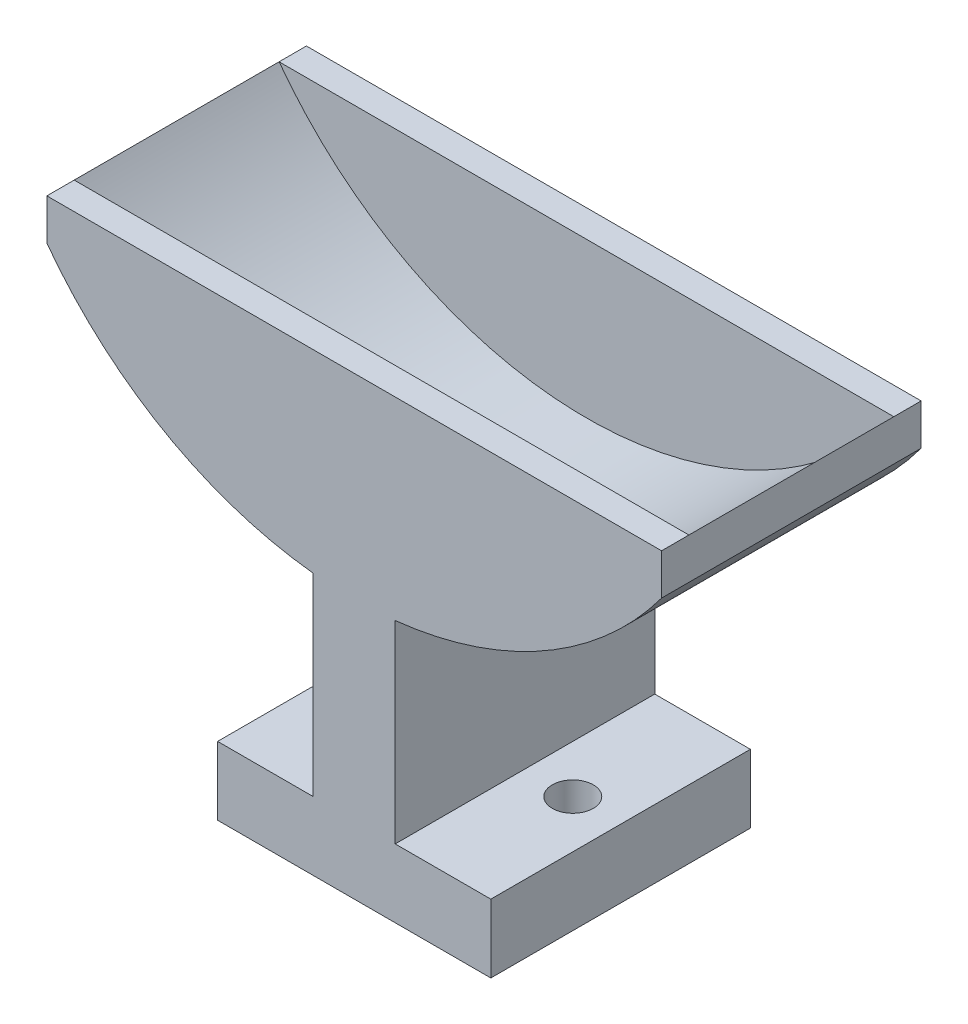
ISO-10303-21;
HEADER;
FILE_DESCRIPTION(('STEP AP214'),'2;1');
FILE_NAME('part.step','',(''),(''),'','','');
FILE_SCHEMA(('AUTOMOTIVE_DESIGN { 1 0 10303 214 1 1 1 1 }'));
ENDSEC;
DATA;
#1=APPLICATION_CONTEXT('core data for automotive mechanical design processes');
#2=APPLICATION_PROTOCOL_DEFINITION('international standard','automotive_design',2000,#1);
#3=PRODUCT_CONTEXT('',#1,'mechanical');
#4=PRODUCT('Part','Part','',(#3));
#5=PRODUCT_RELATED_PRODUCT_CATEGORY('part','',(#4));
#6=PRODUCT_DEFINITION_FORMATION('','',#4);
#7=PRODUCT_DEFINITION_CONTEXT('part definition',#1,'design');
#8=PRODUCT_DEFINITION('design','',#6,#7);
#9=PRODUCT_DEFINITION_SHAPE('','',#8);
#10=(LENGTH_UNIT() NAMED_UNIT(*) SI_UNIT(.MILLI.,.METRE.));
#11=(NAMED_UNIT(*) PLANE_ANGLE_UNIT() SI_UNIT($,.RADIAN.));
#12=(NAMED_UNIT(*) SI_UNIT($,.STERADIAN.) SOLID_ANGLE_UNIT());
#13=UNCERTAINTY_MEASURE_WITH_UNIT(LENGTH_MEASURE(1.E-05),#10,'distance_accuracy_value','');
#14=(GEOMETRIC_REPRESENTATION_CONTEXT(3) GLOBAL_UNCERTAINTY_ASSIGNED_CONTEXT((#13)) GLOBAL_UNIT_ASSIGNED_CONTEXT((#10,
#11,#12)) REPRESENTATION_CONTEXT('',''));
#15=CARTESIAN_POINT('',(0.,0.,0.));
#16=DIRECTION('',(0.,0.,1.));
#17=DIRECTION('',(1.,0.,0.));
#18=AXIS2_PLACEMENT_3D('',#15,#16,#17);
#19=CARTESIAN_POINT('',(13.,0.,19.));
#20=DIRECTION('',(-1.,0.,0.));
#21=DIRECTION('',(0.,0.,1.));
#22=AXIS2_PLACEMENT_3D('',#19,#20,#21);
#23=PLANE('',#22);
#24=DIRECTION('',(0.,1.,0.));
#25=VECTOR('',#24,1.);
#26=CARTESIAN_POINT('',(13.,0.,0.));
#27=LINE('',#26,#25);
#28=CARTESIAN_POINT('',(13.,5.,0.));
#29=VERTEX_POINT('',#28);
#30=CARTESIAN_POINT('',(13.,19.1611781858499,0.));
#31=VERTEX_POINT('',#30);
#32=EDGE_CURVE('E166',#29,#31,#27,.T.);
#33=ORIENTED_EDGE('',*,*,#32,.T.);
#34=DIRECTION('',(0.,0.,-1.));
#35=VECTOR('',#34,1.);
#36=CARTESIAN_POINT('',(13.,19.1611781858499,19.));
#37=LINE('',#36,#35);
#38=CARTESIAN_POINT('',(13.,19.1611781858499,19.));
#39=VERTEX_POINT('',#38);
#40=EDGE_CURVE('E12',#39,#31,#37,.T.);
#41=ORIENTED_EDGE('',*,*,#40,.F.);
#42=DIRECTION('',(0.,1.,0.));
#43=VECTOR('',#42,1.);
#44=CARTESIAN_POINT('',(13.,0.,19.));
#45=LINE('',#44,#43);
#46=CARTESIAN_POINT('',(13.,5.,19.));
#47=VERTEX_POINT('',#46);
#48=EDGE_CURVE('E229',#47,#39,#45,.T.);
#49=ORIENTED_EDGE('',*,*,#48,.F.);
#50=DIRECTION('',(0.,0.,-1.));
#51=VECTOR('',#50,1.);
#52=CARTESIAN_POINT('',(13.,5.,19.));
#53=LINE('',#52,#51);
#54=EDGE_CURVE('E224',#47,#29,#53,.T.);
#55=ORIENTED_EDGE('',*,*,#54,.T.);
#56=EDGE_LOOP('',(#33,#41,#49,#55));
#57=FACE_BOUND('',#56,.T.);
#58=ADVANCED_FACE('F70',(#57),#23,.F.);
#59=CARTESIAN_POINT('',(7.,0.,19.));
#60=DIRECTION('',(-1.,0.,0.));
#61=DIRECTION('',(0.,0.,1.));
#62=AXIS2_PLACEMENT_3D('',#59,#60,#61);
#63=PLANE('',#62);
#64=DIRECTION('',(0.,1.,0.));
#65=VECTOR('',#64,1.);
#66=CARTESIAN_POINT('',(7.,0.,0.));
#67=LINE('',#66,#65);
#68=CARTESIAN_POINT('',(7.,5.,0.));
#69=VERTEX_POINT('',#68);
#70=CARTESIAN_POINT('',(7.,19.1611781858499,0.));
#71=VERTEX_POINT('',#70);
#72=EDGE_CURVE('E152',#69,#71,#67,.T.);
#73=ORIENTED_EDGE('',*,*,#72,.F.);
#74=DIRECTION('',(0.,0.,-1.));
#75=VECTOR('',#74,1.);
#76=CARTESIAN_POINT('',(7.,5.,19.));
#77=LINE('',#76,#75);
#78=CARTESIAN_POINT('',(7.,5.,19.));
#79=VERTEX_POINT('',#78);
#80=EDGE_CURVE('E212',#79,#69,#77,.T.);
#81=ORIENTED_EDGE('',*,*,#80,.F.);
#82=DIRECTION('',(0.,1.,0.));
#83=VECTOR('',#82,1.);
#84=CARTESIAN_POINT('',(7.,0.,19.));
#85=LINE('',#84,#83);
#86=CARTESIAN_POINT('',(7.,19.1611781858499,19.));
#87=VERTEX_POINT('',#86);
#88=EDGE_CURVE('E254',#79,#87,#85,.T.);
#89=ORIENTED_EDGE('',*,*,#88,.T.);
#90=DIRECTION('',(0.,0.,-1.));
#91=VECTOR('',#90,1.);
#92=CARTESIAN_POINT('',(7.,19.1611781858499,19.));
#93=LINE('',#92,#91);
#94=EDGE_CURVE('E79',#87,#71,#93,.T.);
#95=ORIENTED_EDGE('',*,*,#94,.T.);
#96=EDGE_LOOP('',(#73,#81,#89,#95));
#97=FACE_BOUND('',#96,.T.);
#98=ADVANCED_FACE('F333',(#97),#63,.T.);
#99=CARTESIAN_POINT('',(0.,5.,19.));
#100=DIRECTION('',(0.,1.,0.));
#101=DIRECTION('',(-1.,0.,0.));
#102=AXIS2_PLACEMENT_3D('',#99,#100,#101);
#103=PLANE('',#102);
#104=CARTESIAN_POINT('',(3.5,5.,9.5));
#105=DIRECTION('',(0.,1.,0.));
#106=DIRECTION('',(1.,0.,0.));
#107=AXIS2_PLACEMENT_3D('',#104,#105,#106);
#108=CIRCLE('',#107,1.5);
#109=CARTESIAN_POINT('',(5.,5.,9.5));
#110=VERTEX_POINT('',#109);
#111=EDGE_CURVE('E277',#110,#110,#108,.T.);
#112=ORIENTED_EDGE('',*,*,#111,.F.);
#113=EDGE_LOOP('',(#112));
#114=FACE_BOUND('',#113,.T.);
#115=DIRECTION('',(1.,0.,0.));
#116=VECTOR('',#115,1.);
#117=CARTESIAN_POINT('',(0.,5.,0.));
#118=LINE('',#117,#116);
#119=CARTESIAN_POINT('',(0.,5.,0.));
#120=VERTEX_POINT('',#119);
#121=EDGE_CURVE('E237',#120,#69,#118,.T.);
#122=ORIENTED_EDGE('',*,*,#121,.F.);
#123=DIRECTION('',(0.,0.,-1.));
#124=VECTOR('',#123,1.);
#125=CARTESIAN_POINT('',(0.,5.,19.));
#126=LINE('',#125,#124);
#127=CARTESIAN_POINT('',(0.,5.,19.));
#128=VERTEX_POINT('',#127);
#129=EDGE_CURVE('E214',#128,#120,#126,.T.);
#130=ORIENTED_EDGE('',*,*,#129,.F.);
#131=DIRECTION('',(1.,0.,0.));
#132=VECTOR('',#131,1.);
#133=CARTESIAN_POINT('',(0.,5.,19.));
#134=LINE('',#133,#132);
#135=EDGE_CURVE('E251',#128,#79,#134,.T.);
#136=ORIENTED_EDGE('',*,*,#135,.T.);
#137=ORIENTED_EDGE('',*,*,#80,.T.);
#138=EDGE_LOOP('',(#122,#130,#136,#137));
#139=FACE_BOUND('',#138,.T.);
#140=ADVANCED_FACE('F330',(#114,#139),#103,.T.);
#141=CARTESIAN_POINT('',(0.,0.,19.));
#142=DIRECTION('',(-1.,0.,0.));
#143=DIRECTION('',(0.,0.,1.));
#144=AXIS2_PLACEMENT_3D('',#141,#142,#143);
#145=PLANE('',#144);
#146=DIRECTION('',(0.,1.,0.));
#147=VECTOR('',#146,1.);
#148=CARTESIAN_POINT('',(0.,0.,0.));
#149=LINE('',#148,#147);
#150=CARTESIAN_POINT('',(0.,0.,0.));
#151=VERTEX_POINT('',#150);
#152=EDGE_CURVE('E234',#151,#120,#149,.T.);
#153=ORIENTED_EDGE('',*,*,#152,.F.);
#154=DIRECTION('',(0.,0.,-1.));
#155=VECTOR('',#154,1.);
#156=CARTESIAN_POINT('',(0.,0.,19.));
#157=LINE('',#156,#155);
#158=CARTESIAN_POINT('',(0.,0.,19.));
#159=VERTEX_POINT('',#158);
#160=EDGE_CURVE('E216',#159,#151,#157,.T.);
#161=ORIENTED_EDGE('',*,*,#160,.F.);
#162=DIRECTION('',(0.,1.,0.));
#163=VECTOR('',#162,1.);
#164=CARTESIAN_POINT('',(0.,0.,19.));
#165=LINE('',#164,#163);
#166=EDGE_CURVE('E248',#159,#128,#165,.T.);
#167=ORIENTED_EDGE('',*,*,#166,.T.);
#168=ORIENTED_EDGE('',*,*,#129,.T.);
#169=EDGE_LOOP('',(#153,#161,#167,#168));
#170=FACE_BOUND('',#169,.T.);
#171=ADVANCED_FACE('F327',(#170),#145,.T.);
#172=CARTESIAN_POINT('',(0.,0.,19.));
#173=DIRECTION('',(0.,1.,0.));
#174=DIRECTION('',(0.,0.,1.));
#175=AXIS2_PLACEMENT_3D('',#172,#173,#174);
#176=PLANE('',#175);
#177=CARTESIAN_POINT('',(16.5,0.,9.5));
#178=DIRECTION('',(0.,1.,0.));
#179=DIRECTION('',(0.,0.,1.));
#180=AXIS2_PLACEMENT_3D('',#177,#178,#179);
#181=CIRCLE('',#180,1.5);
#182=CARTESIAN_POINT('',(16.5,0.,11.));
#183=VERTEX_POINT('',#182);
#184=EDGE_CURVE('E271',#183,#183,#181,.F.);
#185=ORIENTED_EDGE('',*,*,#184,.F.);
#186=EDGE_LOOP('',(#185));
#187=FACE_BOUND('',#186,.T.);
#188=CARTESIAN_POINT('',(3.5,0.,9.5));
#189=DIRECTION('',(0.,1.,0.));
#190=DIRECTION('',(0.,0.,1.));
#191=AXIS2_PLACEMENT_3D('',#188,#189,#190);
#192=CIRCLE('',#191,1.5);
#193=CARTESIAN_POINT('',(3.5,0.,11.));
#194=VERTEX_POINT('',#193);
#195=EDGE_CURVE('E273',#194,#194,#192,.F.);
#196=ORIENTED_EDGE('',*,*,#195,.F.);
#197=EDGE_LOOP('',(#196));
#198=FACE_BOUND('',#197,.T.);
#199=DIRECTION('',(1.,0.,0.));
#200=VECTOR('',#199,1.);
#201=CARTESIAN_POINT('',(0.,0.,0.));
#202=LINE('',#201,#200);
#203=CARTESIAN_POINT('',(20.,0.,0.));
#204=VERTEX_POINT('',#203);
#205=EDGE_CURVE('E232',#151,#204,#202,.T.);
#206=ORIENTED_EDGE('',*,*,#205,.T.);
#207=DIRECTION('',(0.,0.,-1.));
#208=VECTOR('',#207,1.);
#209=CARTESIAN_POINT('',(20.,0.,19.));
#210=LINE('',#209,#208);
#211=CARTESIAN_POINT('',(20.,0.,19.));
#212=VERTEX_POINT('',#211);
#213=EDGE_CURVE('E218',#212,#204,#210,.T.);
#214=ORIENTED_EDGE('',*,*,#213,.F.);
#215=DIRECTION('',(1.,0.,0.));
#216=VECTOR('',#215,1.);
#217=CARTESIAN_POINT('',(0.,0.,19.));
#218=LINE('',#217,#216);
#219=EDGE_CURVE('E245',#159,#212,#218,.T.);
#220=ORIENTED_EDGE('',*,*,#219,.F.);
#221=ORIENTED_EDGE('',*,*,#160,.T.);
#222=EDGE_LOOP('',(#206,#214,#220,#221));
#223=FACE_BOUND('',#222,.T.);
#224=ADVANCED_FACE('F322',(#187,#198,#223),#176,.F.);
#225=CARTESIAN_POINT('',(20.,0.,19.));
#226=DIRECTION('',(-1.,0.,0.));
#227=DIRECTION('',(0.,0.,1.));
#228=AXIS2_PLACEMENT_3D('',#225,#226,#227);
#229=PLANE('',#228);
#230=DIRECTION('',(0.,1.,0.));
#231=VECTOR('',#230,1.);
#232=CARTESIAN_POINT('',(20.,0.,0.));
#233=LINE('',#232,#231);
#234=CARTESIAN_POINT('',(20.,5.,0.));
#235=VERTEX_POINT('',#234);
#236=EDGE_CURVE('E230',#204,#235,#233,.T.);
#237=ORIENTED_EDGE('',*,*,#236,.T.);
#238=DIRECTION('',(0.,0.,-1.));
#239=VECTOR('',#238,1.);
#240=CARTESIAN_POINT('',(20.,5.,19.));
#241=LINE('',#240,#239);
#242=CARTESIAN_POINT('',(20.,5.,19.));
#243=VERTEX_POINT('',#242);
#244=EDGE_CURVE('E221',#243,#235,#241,.T.);
#245=ORIENTED_EDGE('',*,*,#244,.F.);
#246=DIRECTION('',(0.,1.,0.));
#247=VECTOR('',#246,1.);
#248=CARTESIAN_POINT('',(20.,0.,19.));
#249=LINE('',#248,#247);
#250=EDGE_CURVE('E243',#212,#243,#249,.T.);
#251=ORIENTED_EDGE('',*,*,#250,.F.);
#252=ORIENTED_EDGE('',*,*,#213,.T.);
#253=EDGE_LOOP('',(#237,#245,#251,#252));
#254=FACE_BOUND('',#253,.T.);
#255=ADVANCED_FACE('F291',(#254),#229,.F.);
#256=CARTESIAN_POINT('',(0.,4.99999999999999,19.));
#257=DIRECTION('',(0.,-1.,0.));
#258=DIRECTION('',(1.,0.,0.));
#259=AXIS2_PLACEMENT_3D('',#256,#257,#258);
#260=PLANE('',#259);
#261=CARTESIAN_POINT('',(16.5,5.,9.5));
#262=DIRECTION('',(0.,1.,0.));
#263=DIRECTION('',(-1.,0.,0.));
#264=AXIS2_PLACEMENT_3D('',#261,#262,#263);
#265=CIRCLE('',#264,1.5);
#266=CARTESIAN_POINT('',(15.,5.,9.5));
#267=VERTEX_POINT('',#266);
#268=EDGE_CURVE('E276',#267,#267,#265,.T.);
#269=ORIENTED_EDGE('',*,*,#268,.F.);
#270=EDGE_LOOP('',(#269));
#271=FACE_BOUND('',#270,.T.);
#272=DIRECTION('',(-1.,0.,0.));
#273=VECTOR('',#272,1.);
#274=CARTESIAN_POINT('',(0.,4.99999999999999,0.));
#275=LINE('',#274,#273);
#276=EDGE_CURVE('E227',#235,#29,#275,.T.);
#277=ORIENTED_EDGE('',*,*,#276,.T.);
#278=ORIENTED_EDGE('',*,*,#54,.F.);
#279=DIRECTION('',(-1.,0.,0.));
#280=VECTOR('',#279,1.);
#281=CARTESIAN_POINT('',(0.,4.99999999999999,19.));
#282=LINE('',#281,#280);
#283=EDGE_CURVE('E95',#243,#47,#282,.T.);
#284=ORIENTED_EDGE('',*,*,#283,.F.);
#285=ORIENTED_EDGE('',*,*,#244,.T.);
#286=EDGE_LOOP('',(#277,#278,#284,#285));
#287=FACE_BOUND('',#286,.T.);
#288=ADVANCED_FACE('F287',(#271,#287),#260,.F.);
#289=CARTESIAN_POINT('',(0.,0.,19.));
#290=DIRECTION('',(0.,0.,1.));
#291=DIRECTION('',(1.,0.,0.));
#292=AXIS2_PLACEMENT_3D('',#289,#290,#291);
#293=PLANE('',#292);
#294=ORIENTED_EDGE('',*,*,#48,.T.);
#295=CARTESIAN_POINT('',(10.,47.,19.));
#296=DIRECTION('',(0.,0.,-1.));
#297=DIRECTION('',(-1.,0.,0.));
#298=AXIS2_PLACEMENT_3D('',#295,#296,#297);
#299=CIRCLE('',#298,28.);
#300=CARTESIAN_POINT('',(32.5,30.3341666875011,19.));
#301=VERTEX_POINT('',#300);
#302=EDGE_CURVE('E179',#301,#39,#299,.T.);
#303=ORIENTED_EDGE('',*,*,#302,.F.);
#304=DIRECTION('',(0.,1.,0.));
#305=VECTOR('',#304,1.);
#306=CARTESIAN_POINT('',(32.5,30.3341666875011,19.));
#307=LINE('',#306,#305);
#308=CARTESIAN_POINT('',(32.5,33.334166687501,19.));
#309=VERTEX_POINT('',#308);
#310=EDGE_CURVE('E204',#301,#309,#307,.T.);
#311=ORIENTED_EDGE('',*,*,#310,.T.);
#312=DIRECTION('',(1.,0.,0.));
#313=VECTOR('',#312,1.);
#314=CARTESIAN_POINT('',(32.5,33.3341666875011,19.));
#315=LINE('',#314,#313);
#316=CARTESIAN_POINT('',(-12.5,33.3341666875011,19.));
#317=VERTEX_POINT('',#316);
#318=EDGE_CURVE('E259',#317,#309,#315,.T.);
#319=ORIENTED_EDGE('',*,*,#318,.F.);
#320=DIRECTION('',(0.,1.,0.));
#321=VECTOR('',#320,1.);
#322=CARTESIAN_POINT('',(-12.5,30.334166687501,19.));
#323=LINE('',#322,#321);
#324=CARTESIAN_POINT('',(-12.5,30.334166687501,19.));
#325=VERTEX_POINT('',#324);
#326=EDGE_CURVE('E182',#325,#317,#323,.T.);
#327=ORIENTED_EDGE('',*,*,#326,.F.);
#328=EDGE_CURVE('E162',#87,#325,#299,.T.);
#329=ORIENTED_EDGE('',*,*,#328,.F.);
#330=ORIENTED_EDGE('',*,*,#88,.F.);
#331=ORIENTED_EDGE('',*,*,#135,.F.);
#332=ORIENTED_EDGE('',*,*,#166,.F.);
#333=ORIENTED_EDGE('',*,*,#219,.T.);
#334=ORIENTED_EDGE('',*,*,#250,.T.);
#335=ORIENTED_EDGE('',*,*,#283,.T.);
#336=EDGE_LOOP('',(#294,#303,#311,#319,#327,#329,#330,#331,#332,#333,#334,#335));
#337=FACE_BOUND('',#336,.T.);
#338=ADVANCED_FACE('F290',(#337),#293,.T.);
#339=CARTESIAN_POINT('',(0.,0.,0.));
#340=DIRECTION('',(0.,0.,1.));
#341=DIRECTION('',(1.,0.,0.));
#342=AXIS2_PLACEMENT_3D('',#339,#340,#341);
#343=PLANE('',#342);
#344=ORIENTED_EDGE('',*,*,#32,.F.);
#345=ORIENTED_EDGE('',*,*,#276,.F.);
#346=ORIENTED_EDGE('',*,*,#236,.F.);
#347=ORIENTED_EDGE('',*,*,#205,.F.);
#348=ORIENTED_EDGE('',*,*,#152,.T.);
#349=ORIENTED_EDGE('',*,*,#121,.T.);
#350=ORIENTED_EDGE('',*,*,#72,.T.);
#351=CARTESIAN_POINT('',(10.,47.,0.));
#352=DIRECTION('',(0.,0.,-1.));
#353=DIRECTION('',(-1.,0.,0.));
#354=AXIS2_PLACEMENT_3D('',#351,#352,#353);
#355=CIRCLE('',#354,28.);
#356=CARTESIAN_POINT('',(-12.5,30.334166687501,0.));
#357=VERTEX_POINT('',#356);
#358=EDGE_CURVE('E143',#71,#357,#355,.T.);
#359=ORIENTED_EDGE('',*,*,#358,.T.);
#360=DIRECTION('',(0.,1.,0.));
#361=VECTOR('',#360,1.);
#362=CARTESIAN_POINT('',(-12.5,30.334166687501,0.));
#363=LINE('',#362,#361);
#364=CARTESIAN_POINT('',(-12.5,33.3341666875011,0.));
#365=VERTEX_POINT('',#364);
#366=EDGE_CURVE('E149',#357,#365,#363,.T.);
#367=ORIENTED_EDGE('',*,*,#366,.T.);
#368=DIRECTION('',(-1.,0.,0.));
#369=VECTOR('',#368,1.);
#370=CARTESIAN_POINT('',(32.5,33.3341666875011,0.));
#371=LINE('',#370,#369);
#372=CARTESIAN_POINT('',(32.5,33.334166687501,0.));
#373=VERTEX_POINT('',#372);
#374=EDGE_CURVE('E269',#373,#365,#371,.T.);
#375=ORIENTED_EDGE('',*,*,#374,.F.);
#376=DIRECTION('',(0.,1.,0.));
#377=VECTOR('',#376,1.);
#378=CARTESIAN_POINT('',(32.5,30.3341666875011,0.));
#379=LINE('',#378,#377);
#380=CARTESIAN_POINT('',(32.5,30.3341666875011,0.));
#381=VERTEX_POINT('',#380);
#382=EDGE_CURVE('E156',#381,#373,#379,.T.);
#383=ORIENTED_EDGE('',*,*,#382,.F.);
#384=EDGE_CURVE('E155',#381,#31,#355,.T.);
#385=ORIENTED_EDGE('',*,*,#384,.T.);
#386=EDGE_LOOP('',(#344,#345,#346,#347,#348,#349,#350,#359,#367,#375,#383,#385));
#387=FACE_BOUND('',#386,.T.);
#388=ADVANCED_FACE('F146',(#387),#343,.F.);
#389=CARTESIAN_POINT('',(10.,47.,19.));
#390=DIRECTION('',(0.,0.,-1.));
#391=DIRECTION('',(-1.,0.,0.));
#392=AXIS2_PLACEMENT_3D('',#389,#390,#391);
#393=CYLINDRICAL_SURFACE('',#392,28.);
#394=ORIENTED_EDGE('',*,*,#358,.F.);
#395=ORIENTED_EDGE('',*,*,#94,.F.);
#396=ORIENTED_EDGE('',*,*,#328,.T.);
#397=DIRECTION('',(0.,0.,-1.));
#398=VECTOR('',#397,1.);
#399=CARTESIAN_POINT('',(-12.5,30.334166687501,19.));
#400=LINE('',#399,#398);
#401=EDGE_CURVE('E159',#325,#357,#400,.T.);
#402=ORIENTED_EDGE('',*,*,#401,.T.);
#403=EDGE_LOOP('',(#394,#395,#396,#402));
#404=FACE_BOUND('',#403,.T.);
#405=ADVANCED_FACE('F160',(#404),#393,.T.);
#406=ORIENTED_EDGE('',*,*,#40,.T.);
#407=ORIENTED_EDGE('',*,*,#384,.F.);
#408=DIRECTION('',(0.,0.,-1.));
#409=VECTOR('',#408,1.);
#410=CARTESIAN_POINT('',(32.5,30.3341666875011,19.));
#411=LINE('',#410,#409);
#412=EDGE_CURVE('E167',#301,#381,#411,.T.);
#413=ORIENTED_EDGE('',*,*,#412,.F.);
#414=ORIENTED_EDGE('',*,*,#302,.T.);
#415=EDGE_LOOP('',(#406,#407,#413,#414));
#416=FACE_BOUND('',#415,.T.);
#417=ADVANCED_FACE('F301',(#416),#393,.T.);
#418=CARTESIAN_POINT('',(32.5,30.3341666875011,19.));
#419=DIRECTION('',(-1.,0.,0.));
#420=DIRECTION('',(0.,0.,1.));
#421=AXIS2_PLACEMENT_3D('',#418,#419,#420);
#422=PLANE('',#421);
#423=ORIENTED_EDGE('',*,*,#382,.T.);
#424=DIRECTION('',(0.,0.,-1.));
#425=VECTOR('',#424,1.);
#426=CARTESIAN_POINT('',(32.5,33.3341666875011,2.));
#427=LINE('',#426,#425);
#428=CARTESIAN_POINT('',(32.5,33.334166687501,2.));
#429=VERTEX_POINT('',#428);
#430=EDGE_CURVE('E260',#429,#373,#427,.T.);
#431=ORIENTED_EDGE('',*,*,#430,.F.);
#432=DIRECTION('',(0.,0.,-1.));
#433=VECTOR('',#432,1.);
#434=CARTESIAN_POINT('',(32.5,33.334166687501,19.));
#435=LINE('',#434,#433);
#436=CARTESIAN_POINT('',(32.5,33.3341666875011,17.));
#437=VERTEX_POINT('',#436);
#438=EDGE_CURVE('E186',#437,#429,#435,.T.);
#439=ORIENTED_EDGE('',*,*,#438,.F.);
#440=EDGE_CURVE('E184',#309,#437,#435,.T.);
#441=ORIENTED_EDGE('',*,*,#440,.F.);
#442=ORIENTED_EDGE('',*,*,#310,.F.);
#443=ORIENTED_EDGE('',*,*,#412,.T.);
#444=EDGE_LOOP('',(#423,#431,#439,#441,#442,#443));
#445=FACE_BOUND('',#444,.T.);
#446=ADVANCED_FACE('F348',(#445),#422,.F.);
#447=CARTESIAN_POINT('',(10.,50.,19.));
#448=DIRECTION('',(0.,0.,-1.));
#449=DIRECTION('',(-1.,0.,0.));
#450=AXIS2_PLACEMENT_3D('',#447,#448,#449);
#451=CYLINDRICAL_SURFACE('',#450,28.);
#452=CARTESIAN_POINT('',(10.,50.,2.));
#453=DIRECTION('',(0.,0.,1.));
#454=DIRECTION('',(1.,0.,0.));
#455=AXIS2_PLACEMENT_3D('',#452,#453,#454);
#456=CIRCLE('',#455,28.);
#457=CARTESIAN_POINT('',(-12.5,33.3341666875011,2.));
#458=VERTEX_POINT('',#457);
#459=EDGE_CURVE('E264',#429,#458,#456,.F.);
#460=ORIENTED_EDGE('',*,*,#459,.T.);
#461=DIRECTION('',(0.,0.,-1.));
#462=VECTOR('',#461,1.);
#463=CARTESIAN_POINT('',(-12.5,33.3341666875011,19.));
#464=LINE('',#463,#462);
#465=CARTESIAN_POINT('',(-12.5,33.3341666875011,17.));
#466=VERTEX_POINT('',#465);
#467=EDGE_CURVE('E197',#466,#458,#464,.T.);
#468=ORIENTED_EDGE('',*,*,#467,.F.);
#469=CARTESIAN_POINT('',(10.,50.,17.));
#470=DIRECTION('',(0.,0.,-1.));
#471=DIRECTION('',(-1.,0.,0.));
#472=AXIS2_PLACEMENT_3D('',#469,#470,#471);
#473=CIRCLE('',#472,28.);
#474=EDGE_CURVE('E86',#466,#437,#473,.F.);
#475=ORIENTED_EDGE('',*,*,#474,.T.);
#476=ORIENTED_EDGE('',*,*,#438,.T.);
#477=EDGE_LOOP('',(#460,#468,#475,#476));
#478=FACE_BOUND('',#477,.T.);
#479=ADVANCED_FACE('F346',(#478),#451,.F.);
#480=CARTESIAN_POINT('',(-12.5,30.334166687501,19.));
#481=DIRECTION('',(-1.,0.,0.));
#482=DIRECTION('',(0.,0.,1.));
#483=AXIS2_PLACEMENT_3D('',#480,#481,#482);
#484=PLANE('',#483);
#485=ORIENTED_EDGE('',*,*,#366,.F.);
#486=ORIENTED_EDGE('',*,*,#401,.F.);
#487=ORIENTED_EDGE('',*,*,#326,.T.);
#488=EDGE_CURVE('E74',#317,#466,#464,.T.);
#489=ORIENTED_EDGE('',*,*,#488,.T.);
#490=ORIENTED_EDGE('',*,*,#467,.T.);
#491=DIRECTION('',(0.,0.,1.));
#492=VECTOR('',#491,1.);
#493=CARTESIAN_POINT('',(-12.5,33.3341666875011,0.));
#494=LINE('',#493,#492);
#495=EDGE_CURVE('E172',#365,#458,#494,.T.);
#496=ORIENTED_EDGE('',*,*,#495,.F.);
#497=EDGE_LOOP('',(#485,#486,#487,#489,#490,#496));
#498=FACE_BOUND('',#497,.T.);
#499=ADVANCED_FACE('F72',(#498),#484,.T.);
#500=CARTESIAN_POINT('',(0.,33.3341666875011,0.));
#501=DIRECTION('',(0.,-1.,0.));
#502=DIRECTION('',(0.,0.,-1.));
#503=AXIS2_PLACEMENT_3D('',#500,#501,#502);
#504=PLANE('',#503);
#505=ORIENTED_EDGE('',*,*,#318,.T.);
#506=ORIENTED_EDGE('',*,*,#440,.T.);
#507=DIRECTION('',(-1.,0.,0.));
#508=VECTOR('',#507,1.);
#509=CARTESIAN_POINT('',(-12.5,33.3341666875011,17.));
#510=LINE('',#509,#508);
#511=EDGE_CURVE('E176',#437,#466,#510,.T.);
#512=ORIENTED_EDGE('',*,*,#511,.T.);
#513=ORIENTED_EDGE('',*,*,#488,.F.);
#514=EDGE_LOOP('',(#505,#506,#512,#513));
#515=FACE_BOUND('',#514,.T.);
#516=ADVANCED_FACE('F361',(#515),#504,.F.);
#517=CARTESIAN_POINT('',(-12.5,-0.001000000000001,17.));
#518=DIRECTION('',(0.,0.,-1.));
#519=DIRECTION('',(-1.,0.,0.));
#520=AXIS2_PLACEMENT_3D('',#517,#518,#519);
#521=PLANE('',#520);
#522=ORIENTED_EDGE('',*,*,#474,.F.);
#523=ORIENTED_EDGE('',*,*,#511,.F.);
#524=EDGE_LOOP('',(#522,#523));
#525=FACE_BOUND('',#524,.T.);
#526=ADVANCED_FACE('F367',(#525),#521,.T.);
#527=CARTESIAN_POINT('',(0.,33.3341666875011,0.));
#528=DIRECTION('',(0.,1.,0.));
#529=DIRECTION('',(0.,0.,1.));
#530=AXIS2_PLACEMENT_3D('',#527,#528,#529);
#531=PLANE('',#530);
#532=ORIENTED_EDGE('',*,*,#374,.T.);
#533=ORIENTED_EDGE('',*,*,#495,.T.);
#534=DIRECTION('',(1.,0.,0.));
#535=VECTOR('',#534,1.);
#536=CARTESIAN_POINT('',(-12.5,33.3341666875011,2.));
#537=LINE('',#536,#535);
#538=EDGE_CURVE('E265',#458,#429,#537,.T.);
#539=ORIENTED_EDGE('',*,*,#538,.T.);
#540=ORIENTED_EDGE('',*,*,#430,.T.);
#541=EDGE_LOOP('',(#532,#533,#539,#540));
#542=FACE_BOUND('',#541,.T.);
#543=ADVANCED_FACE('F345',(#542),#531,.T.);
#544=CARTESIAN_POINT('',(-12.5,-0.001000000000001,2.));
#545=DIRECTION('',(0.,0.,1.));
#546=DIRECTION('',(1.,0.,0.));
#547=AXIS2_PLACEMENT_3D('',#544,#545,#546);
#548=PLANE('',#547);
#549=ORIENTED_EDGE('',*,*,#459,.F.);
#550=ORIENTED_EDGE('',*,*,#538,.F.);
#551=EDGE_LOOP('',(#549,#550));
#552=FACE_BOUND('',#551,.T.);
#553=ADVANCED_FACE('F342',(#552),#548,.T.);
#554=CARTESIAN_POINT('',(16.5,-4.24264068711929,9.5));
#555=DIRECTION('',(0.,1.,0.));
#556=DIRECTION('',(-1.,0.,0.));
#557=AXIS2_PLACEMENT_3D('',#554,#555,#556);
#558=CYLINDRICAL_SURFACE('',#557,1.5);
#559=ORIENTED_EDGE('',*,*,#184,.T.);
#560=EDGE_LOOP('',(#559));
#561=FACE_BOUND('',#560,.T.);
#562=ORIENTED_EDGE('',*,*,#268,.T.);
#563=EDGE_LOOP('',(#562));
#564=FACE_BOUND('',#563,.T.);
#565=ADVANCED_FACE('F285',(#561,#564),#558,.F.);
#566=CARTESIAN_POINT('',(3.5,-4.24264068711929,9.5));
#567=DIRECTION('',(0.,1.,0.));
#568=DIRECTION('',(-1.,0.,0.));
#569=AXIS2_PLACEMENT_3D('',#566,#567,#568);
#570=CYLINDRICAL_SURFACE('',#569,1.5);
#571=ORIENTED_EDGE('',*,*,#195,.T.);
#572=EDGE_LOOP('',(#571));
#573=FACE_BOUND('',#572,.T.);
#574=ORIENTED_EDGE('',*,*,#111,.T.);
#575=EDGE_LOOP('',(#574));
#576=FACE_BOUND('',#575,.T.);
#577=ADVANCED_FACE('F474',(#573,#576),#570,.F.);
#578=CLOSED_SHELL('',(#58,#98,#140,#171,#224,#255,#288,#338,#388,#405,#417,#446,#479,#499,#516,
#526,#543,#553,#565,#577));
#579=MANIFOLD_SOLID_BREP('B2',#578);
#580=ADVANCED_BREP_SHAPE_REPRESENTATION('',(#18,#579),#14);
#581=SHAPE_DEFINITION_REPRESENTATION(#9,#580);
ENDSEC;
END-ISO-10303-21;
